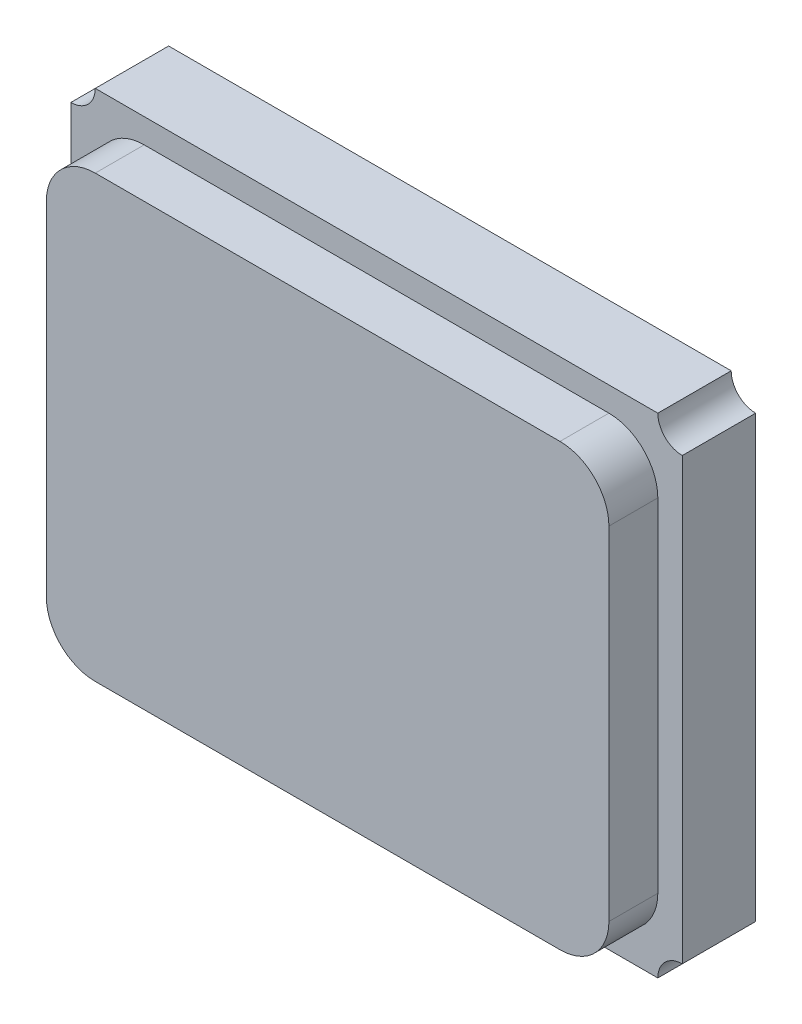
ISO-10303-21;
HEADER;
FILE_DESCRIPTION(('STEP AP214'),'2;1');
FILE_NAME('part.step','',(''),(''),'','','');
FILE_SCHEMA(('AUTOMOTIVE_DESIGN { 1 0 10303 214 1 1 1 1 }'));
ENDSEC;
DATA;
#1=APPLICATION_CONTEXT('core data for automotive mechanical design processes');
#2=APPLICATION_PROTOCOL_DEFINITION('international standard','automotive_design',2000,#1);
#3=PRODUCT_CONTEXT('',#1,'mechanical');
#4=PRODUCT('Part','Part','',(#3));
#5=PRODUCT_RELATED_PRODUCT_CATEGORY('part','',(#4));
#6=PRODUCT_DEFINITION_FORMATION('','',#4);
#7=PRODUCT_DEFINITION_CONTEXT('part definition',#1,'design');
#8=PRODUCT_DEFINITION('design','',#6,#7);
#9=PRODUCT_DEFINITION_SHAPE('','',#8);
#10=(LENGTH_UNIT() NAMED_UNIT(*) SI_UNIT(.MILLI.,.METRE.));
#11=(NAMED_UNIT(*) PLANE_ANGLE_UNIT() SI_UNIT($,.RADIAN.));
#12=(NAMED_UNIT(*) SI_UNIT($,.STERADIAN.) SOLID_ANGLE_UNIT());
#13=UNCERTAINTY_MEASURE_WITH_UNIT(LENGTH_MEASURE(1.E-05),#10,'distance_accuracy_value','');
#14=(GEOMETRIC_REPRESENTATION_CONTEXT(3) GLOBAL_UNCERTAINTY_ASSIGNED_CONTEXT((#13)) GLOBAL_UNIT_ASSIGNED_CONTEXT((#10,
#11,#12)) REPRESENTATION_CONTEXT('',''));
#15=CARTESIAN_POINT('',(0.,0.,0.));
#16=DIRECTION('',(0.,0.,1.));
#17=DIRECTION('',(1.,0.,0.));
#18=AXIS2_PLACEMENT_3D('',#15,#16,#17);
#19=CARTESIAN_POINT('',(-1.25,1.,0.3));
#20=DIRECTION('',(0.,0.,1.));
#21=DIRECTION('',(1.,0.,0.));
#22=AXIS2_PLACEMENT_3D('',#19,#20,#21);
#23=PLANE('',#22);
#24=CARTESIAN_POINT('',(-1.25,1.,0.3));
#25=DIRECTION('',(0.,0.,-1.));
#26=DIRECTION('',(1.,0.,0.));
#27=AXIS2_PLACEMENT_3D('',#24,#25,#26);
#28=CIRCLE('',#27,0.1);
#29=CARTESIAN_POINT('',(-1.15,0.999999999999999,0.3));
#30=VERTEX_POINT('',#29);
#31=CARTESIAN_POINT('',(-1.25,0.899999999999999,0.3));
#32=VERTEX_POINT('',#31);
#33=EDGE_CURVE('E156',#30,#32,#28,.T.);
#34=ORIENTED_EDGE('',*,*,#33,.T.);
#35=DIRECTION('',(0.,-1.,0.));
#36=VECTOR('',#35,1.);
#37=CARTESIAN_POINT('',(-1.25,-0.9,0.3));
#38=LINE('',#37,#36);
#39=CARTESIAN_POINT('',(-1.25,-0.9,0.3));
#40=VERTEX_POINT('',#39);
#41=EDGE_CURVE('E96',#32,#40,#38,.T.);
#42=ORIENTED_EDGE('',*,*,#41,.T.);
#43=CARTESIAN_POINT('',(-1.25,-1.,0.3));
#44=DIRECTION('',(0.,0.,-1.));
#45=DIRECTION('',(-1.,0.,0.));
#46=AXIS2_PLACEMENT_3D('',#43,#44,#45);
#47=CIRCLE('',#46,0.1);
#48=CARTESIAN_POINT('',(-1.15,-1.,0.3));
#49=VERTEX_POINT('',#48);
#50=EDGE_CURVE('E171',#40,#49,#47,.T.);
#51=ORIENTED_EDGE('',*,*,#50,.T.);
#52=DIRECTION('',(1.,0.,0.));
#53=VECTOR('',#52,1.);
#54=CARTESIAN_POINT('',(1.15,-1.,0.3));
#55=LINE('',#54,#53);
#56=CARTESIAN_POINT('',(1.15,-1.,0.3));
#57=VERTEX_POINT('',#56);
#58=EDGE_CURVE('E183',#49,#57,#55,.T.);
#59=ORIENTED_EDGE('',*,*,#58,.T.);
#60=CARTESIAN_POINT('',(1.25,-1.,0.3));
#61=DIRECTION('',(0.,0.,-1.));
#62=DIRECTION('',(1.,0.,0.));
#63=AXIS2_PLACEMENT_3D('',#60,#61,#62);
#64=CIRCLE('',#63,0.1);
#65=CARTESIAN_POINT('',(1.25,-0.9,0.3));
#66=VERTEX_POINT('',#65);
#67=EDGE_CURVE('E119',#57,#66,#64,.T.);
#68=ORIENTED_EDGE('',*,*,#67,.T.);
#69=DIRECTION('',(0.,1.,0.));
#70=VECTOR('',#69,1.);
#71=CARTESIAN_POINT('',(1.25,-0.9,0.3));
#72=LINE('',#71,#70);
#73=CARTESIAN_POINT('',(1.25,0.9,0.3));
#74=VERTEX_POINT('',#73);
#75=EDGE_CURVE('E112',#66,#74,#72,.T.);
#76=ORIENTED_EDGE('',*,*,#75,.T.);
#77=CARTESIAN_POINT('',(1.25,1.,0.3));
#78=DIRECTION('',(0.,0.,-1.));
#79=DIRECTION('',(-1.,0.,0.));
#80=AXIS2_PLACEMENT_3D('',#77,#78,#79);
#81=CIRCLE('',#80,0.1);
#82=CARTESIAN_POINT('',(1.15,1.,0.3));
#83=VERTEX_POINT('',#82);
#84=EDGE_CURVE('E116',#74,#83,#81,.T.);
#85=ORIENTED_EDGE('',*,*,#84,.T.);
#86=DIRECTION('',(-1.,0.,0.));
#87=VECTOR('',#86,1.);
#88=CARTESIAN_POINT('',(1.15,1.,0.3));
#89=LINE('',#88,#87);
#90=EDGE_CURVE('E55',#83,#30,#89,.T.);
#91=ORIENTED_EDGE('',*,*,#90,.T.);
#92=EDGE_LOOP('',(#34,#42,#51,#59,#68,#76,#85,#91));
#93=FACE_BOUND('',#92,.T.);
#94=DIRECTION('',(-1.,0.,0.));
#95=VECTOR('',#94,1.);
#96=CARTESIAN_POINT('',(-0.95,0.9,0.3));
#97=LINE('',#96,#95);
#98=CARTESIAN_POINT('',(0.95,0.9,0.3));
#99=VERTEX_POINT('',#98);
#100=CARTESIAN_POINT('',(-0.95,0.9,0.3));
#101=VERTEX_POINT('',#100);
#102=EDGE_CURVE('E228',#99,#101,#97,.T.);
#103=ORIENTED_EDGE('',*,*,#102,.F.);
#104=CARTESIAN_POINT('',(0.95,0.7,0.3));
#105=DIRECTION('',(0.,0.,1.));
#106=DIRECTION('',(-1.,0.,0.));
#107=AXIS2_PLACEMENT_3D('',#104,#105,#106);
#108=CIRCLE('',#107,0.2);
#109=CARTESIAN_POINT('',(1.15,0.7,0.3));
#110=VERTEX_POINT('',#109);
#111=EDGE_CURVE('E231',#110,#99,#108,.T.);
#112=ORIENTED_EDGE('',*,*,#111,.F.);
#113=DIRECTION('',(0.,1.,0.));
#114=VECTOR('',#113,1.);
#115=CARTESIAN_POINT('',(1.15,0.7,0.3));
#116=LINE('',#115,#114);
#117=CARTESIAN_POINT('',(1.15,-0.7,0.3));
#118=VERTEX_POINT('',#117);
#119=EDGE_CURVE('E211',#118,#110,#116,.T.);
#120=ORIENTED_EDGE('',*,*,#119,.F.);
#121=CARTESIAN_POINT('',(0.95,-0.7,0.3));
#122=DIRECTION('',(0.,0.,1.));
#123=DIRECTION('',(1.,0.,0.));
#124=AXIS2_PLACEMENT_3D('',#121,#122,#123);
#125=CIRCLE('',#124,0.2);
#126=CARTESIAN_POINT('',(0.95,-0.9,0.3));
#127=VERTEX_POINT('',#126);
#128=EDGE_CURVE('E214',#127,#118,#125,.T.);
#129=ORIENTED_EDGE('',*,*,#128,.F.);
#130=DIRECTION('',(1.,0.,0.));
#131=VECTOR('',#130,1.);
#132=CARTESIAN_POINT('',(-0.95,-0.9,0.3));
#133=LINE('',#132,#131);
#134=CARTESIAN_POINT('',(-0.95,-0.9,0.3));
#135=VERTEX_POINT('',#134);
#136=EDGE_CURVE('E216',#135,#127,#133,.T.);
#137=ORIENTED_EDGE('',*,*,#136,.F.);
#138=CARTESIAN_POINT('',(-0.95,-0.7,0.3));
#139=DIRECTION('',(0.,0.,1.));
#140=DIRECTION('',(-1.,0.,0.));
#141=AXIS2_PLACEMENT_3D('',#138,#139,#140);
#142=CIRCLE('',#141,0.2);
#143=CARTESIAN_POINT('',(-1.15,-0.7,0.3));
#144=VERTEX_POINT('',#143);
#145=EDGE_CURVE('E219',#144,#135,#142,.T.);
#146=ORIENTED_EDGE('',*,*,#145,.F.);
#147=DIRECTION('',(0.,-1.,0.));
#148=VECTOR('',#147,1.);
#149=CARTESIAN_POINT('',(-1.15,0.7,0.3));
#150=LINE('',#149,#148);
#151=CARTESIAN_POINT('',(-1.15,0.7,0.3));
#152=VERTEX_POINT('',#151);
#153=EDGE_CURVE('E222',#152,#144,#150,.T.);
#154=ORIENTED_EDGE('',*,*,#153,.F.);
#155=CARTESIAN_POINT('',(-0.95,0.7,0.3));
#156=DIRECTION('',(0.,0.,1.));
#157=DIRECTION('',(1.,0.,0.));
#158=AXIS2_PLACEMENT_3D('',#155,#156,#157);
#159=CIRCLE('',#158,0.2);
#160=EDGE_CURVE('E225',#101,#152,#159,.T.);
#161=ORIENTED_EDGE('',*,*,#160,.F.);
#162=EDGE_LOOP('',(#103,#112,#120,#129,#137,#146,#154,#161));
#163=FACE_BOUND('',#162,.T.);
#164=ADVANCED_FACE('F31',(#93,#163),#23,.T.);
#165=CARTESIAN_POINT('',(-1.25,1.,0.3));
#166=DIRECTION('',(0.,0.,-1.));
#167=DIRECTION('',(-1.,0.,0.));
#168=AXIS2_PLACEMENT_3D('',#165,#166,#167);
#169=CYLINDRICAL_SURFACE('',#168,0.1);
#170=CARTESIAN_POINT('',(-1.25,1.,0.));
#171=DIRECTION('',(0.,0.,-1.));
#172=DIRECTION('',(1.,0.,0.));
#173=AXIS2_PLACEMENT_3D('',#170,#171,#172);
#174=CIRCLE('',#173,0.1);
#175=CARTESIAN_POINT('',(-1.15,0.999999999999999,0.));
#176=VERTEX_POINT('',#175);
#177=CARTESIAN_POINT('',(-1.25,0.899999999999999,0.));
#178=VERTEX_POINT('',#177);
#179=EDGE_CURVE('E140',#176,#178,#174,.T.);
#180=ORIENTED_EDGE('',*,*,#179,.T.);
#181=DIRECTION('',(0.,0.,-1.));
#182=VECTOR('',#181,1.);
#183=CARTESIAN_POINT('',(-1.25,0.899999999999999,0.3));
#184=LINE('',#183,#182);
#185=EDGE_CURVE('E11',#32,#178,#184,.T.);
#186=ORIENTED_EDGE('',*,*,#185,.F.);
#187=ORIENTED_EDGE('',*,*,#33,.F.);
#188=DIRECTION('',(0.,0.,-1.));
#189=VECTOR('',#188,1.);
#190=CARTESIAN_POINT('',(-1.15,0.999999999999999,0.3));
#191=LINE('',#190,#189);
#192=EDGE_CURVE('E136',#30,#176,#191,.T.);
#193=ORIENTED_EDGE('',*,*,#192,.T.);
#194=EDGE_LOOP('',(#180,#186,#187,#193));
#195=FACE_BOUND('',#194,.T.);
#196=ADVANCED_FACE('F33',(#195),#169,.F.);
#197=CARTESIAN_POINT('',(-1.25,-0.9,0.3));
#198=DIRECTION('',(1.,0.,0.));
#199=DIRECTION('',(0.,1.,0.));
#200=AXIS2_PLACEMENT_3D('',#197,#198,#199);
#201=PLANE('',#200);
#202=DIRECTION('',(0.,-1.,0.));
#203=VECTOR('',#202,1.);
#204=CARTESIAN_POINT('',(-1.25,-0.9,0.));
#205=LINE('',#204,#203);
#206=CARTESIAN_POINT('',(-1.25,-0.9,0.));
#207=VERTEX_POINT('',#206);
#208=EDGE_CURVE('E143',#178,#207,#205,.T.);
#209=ORIENTED_EDGE('',*,*,#208,.T.);
#210=DIRECTION('',(0.,0.,-1.));
#211=VECTOR('',#210,1.);
#212=CARTESIAN_POINT('',(-1.25,-0.9,0.3));
#213=LINE('',#212,#211);
#214=EDGE_CURVE('E39',#40,#207,#213,.T.);
#215=ORIENTED_EDGE('',*,*,#214,.F.);
#216=ORIENTED_EDGE('',*,*,#41,.F.);
#217=ORIENTED_EDGE('',*,*,#185,.T.);
#218=EDGE_LOOP('',(#209,#215,#216,#217));
#219=FACE_BOUND('',#218,.T.);
#220=ADVANCED_FACE('F333',(#219),#201,.F.);
#221=CARTESIAN_POINT('',(-1.25,-1.,0.3));
#222=DIRECTION('',(0.,0.,-1.));
#223=DIRECTION('',(-1.,0.,0.));
#224=AXIS2_PLACEMENT_3D('',#221,#222,#223);
#225=CYLINDRICAL_SURFACE('',#224,0.1);
#226=CARTESIAN_POINT('',(-1.25,-1.,0.));
#227=DIRECTION('',(0.,0.,-1.));
#228=DIRECTION('',(-1.,0.,0.));
#229=AXIS2_PLACEMENT_3D('',#226,#227,#228);
#230=CIRCLE('',#229,0.1);
#231=CARTESIAN_POINT('',(-1.15,-1.,0.));
#232=VERTEX_POINT('',#231);
#233=EDGE_CURVE('E146',#207,#232,#230,.T.);
#234=ORIENTED_EDGE('',*,*,#233,.T.);
#235=DIRECTION('',(0.,0.,-1.));
#236=VECTOR('',#235,1.);
#237=CARTESIAN_POINT('',(-1.15,-1.,0.3));
#238=LINE('',#237,#236);
#239=EDGE_CURVE('E163',#49,#232,#238,.T.);
#240=ORIENTED_EDGE('',*,*,#239,.F.);
#241=ORIENTED_EDGE('',*,*,#50,.F.);
#242=ORIENTED_EDGE('',*,*,#214,.T.);
#243=EDGE_LOOP('',(#234,#240,#241,#242));
#244=FACE_BOUND('',#243,.T.);
#245=ADVANCED_FACE('F169',(#244),#225,.F.);
#246=CARTESIAN_POINT('',(1.15,-1.,0.3));
#247=DIRECTION('',(0.,1.,0.));
#248=DIRECTION('',(-1.,0.,0.));
#249=AXIS2_PLACEMENT_3D('',#246,#247,#248);
#250=PLANE('',#249);
#251=DIRECTION('',(1.,0.,0.));
#252=VECTOR('',#251,1.);
#253=CARTESIAN_POINT('',(1.15,-1.,0.));
#254=LINE('',#253,#252);
#255=CARTESIAN_POINT('',(1.15,-1.,0.));
#256=VERTEX_POINT('',#255);
#257=EDGE_CURVE('E148',#232,#256,#254,.T.);
#258=ORIENTED_EDGE('',*,*,#257,.T.);
#259=DIRECTION('',(0.,0.,-1.));
#260=VECTOR('',#259,1.);
#261=CARTESIAN_POINT('',(1.15,-1.,0.3));
#262=LINE('',#261,#260);
#263=EDGE_CURVE('E160',#57,#256,#262,.T.);
#264=ORIENTED_EDGE('',*,*,#263,.F.);
#265=ORIENTED_EDGE('',*,*,#58,.F.);
#266=ORIENTED_EDGE('',*,*,#239,.T.);
#267=EDGE_LOOP('',(#258,#264,#265,#266));
#268=FACE_BOUND('',#267,.T.);
#269=ADVANCED_FACE('F179',(#268),#250,.F.);
#270=CARTESIAN_POINT('',(1.25,-1.,0.3));
#271=DIRECTION('',(0.,0.,-1.));
#272=DIRECTION('',(-1.,0.,0.));
#273=AXIS2_PLACEMENT_3D('',#270,#271,#272);
#274=CYLINDRICAL_SURFACE('',#273,0.1);
#275=CARTESIAN_POINT('',(1.25,-1.,0.));
#276=DIRECTION('',(0.,0.,-1.));
#277=DIRECTION('',(1.,0.,0.));
#278=AXIS2_PLACEMENT_3D('',#275,#276,#277);
#279=CIRCLE('',#278,0.1);
#280=CARTESIAN_POINT('',(1.25,-0.9,0.));
#281=VERTEX_POINT('',#280);
#282=EDGE_CURVE('E150',#256,#281,#279,.T.);
#283=ORIENTED_EDGE('',*,*,#282,.T.);
#284=DIRECTION('',(0.,0.,-1.));
#285=VECTOR('',#284,1.);
#286=CARTESIAN_POINT('',(1.25,-0.9,0.3));
#287=LINE('',#286,#285);
#288=EDGE_CURVE('E131',#66,#281,#287,.T.);
#289=ORIENTED_EDGE('',*,*,#288,.F.);
#290=ORIENTED_EDGE('',*,*,#67,.F.);
#291=ORIENTED_EDGE('',*,*,#263,.T.);
#292=EDGE_LOOP('',(#283,#289,#290,#291));
#293=FACE_BOUND('',#292,.T.);
#294=ADVANCED_FACE('F182',(#293),#274,.F.);
#295=CARTESIAN_POINT('',(1.25,-0.9,0.3));
#296=DIRECTION('',(-1.,0.,0.));
#297=DIRECTION('',(0.,-1.,0.));
#298=AXIS2_PLACEMENT_3D('',#295,#296,#297);
#299=PLANE('',#298);
#300=DIRECTION('',(0.,1.,0.));
#301=VECTOR('',#300,1.);
#302=CARTESIAN_POINT('',(1.25,-0.9,0.));
#303=LINE('',#302,#301);
#304=CARTESIAN_POINT('',(1.25,0.9,0.));
#305=VERTEX_POINT('',#304);
#306=EDGE_CURVE('E128',#281,#305,#303,.T.);
#307=ORIENTED_EDGE('',*,*,#306,.T.);
#308=DIRECTION('',(0.,0.,-1.));
#309=VECTOR('',#308,1.);
#310=CARTESIAN_POINT('',(1.25,0.9,0.3));
#311=LINE('',#310,#309);
#312=EDGE_CURVE('E125',#74,#305,#311,.T.);
#313=ORIENTED_EDGE('',*,*,#312,.F.);
#314=ORIENTED_EDGE('',*,*,#75,.F.);
#315=ORIENTED_EDGE('',*,*,#288,.T.);
#316=EDGE_LOOP('',(#307,#313,#314,#315));
#317=FACE_BOUND('',#316,.T.);
#318=ADVANCED_FACE('F126',(#317),#299,.F.);
#319=CARTESIAN_POINT('',(1.25,1.,0.3));
#320=DIRECTION('',(0.,0.,-1.));
#321=DIRECTION('',(-1.,0.,0.));
#322=AXIS2_PLACEMENT_3D('',#319,#320,#321);
#323=CYLINDRICAL_SURFACE('',#322,0.1);
#324=CARTESIAN_POINT('',(1.25,1.,0.));
#325=DIRECTION('',(0.,0.,-1.));
#326=DIRECTION('',(-1.,0.,0.));
#327=AXIS2_PLACEMENT_3D('',#324,#325,#326);
#328=CIRCLE('',#327,0.1);
#329=CARTESIAN_POINT('',(1.15,1.,0.));
#330=VERTEX_POINT('',#329);
#331=EDGE_CURVE('E153',#305,#330,#328,.T.);
#332=ORIENTED_EDGE('',*,*,#331,.T.);
#333=DIRECTION('',(0.,0.,-1.));
#334=VECTOR('',#333,1.);
#335=CARTESIAN_POINT('',(1.15,1.,0.3));
#336=LINE('',#335,#334);
#337=EDGE_CURVE('E132',#83,#330,#336,.T.);
#338=ORIENTED_EDGE('',*,*,#337,.F.);
#339=ORIENTED_EDGE('',*,*,#84,.F.);
#340=ORIENTED_EDGE('',*,*,#312,.T.);
#341=EDGE_LOOP('',(#332,#338,#339,#340));
#342=FACE_BOUND('',#341,.T.);
#343=ADVANCED_FACE('F134',(#342),#323,.F.);
#344=CARTESIAN_POINT('',(1.15,1.,0.3));
#345=DIRECTION('',(0.,-1.,0.));
#346=DIRECTION('',(1.,0.,0.));
#347=AXIS2_PLACEMENT_3D('',#344,#345,#346);
#348=PLANE('',#347);
#349=DIRECTION('',(-1.,0.,0.));
#350=VECTOR('',#349,1.);
#351=CARTESIAN_POINT('',(1.15,1.,0.));
#352=LINE('',#351,#350);
#353=EDGE_CURVE('E88',#330,#176,#352,.T.);
#354=ORIENTED_EDGE('',*,*,#353,.T.);
#355=ORIENTED_EDGE('',*,*,#192,.F.);
#356=ORIENTED_EDGE('',*,*,#90,.F.);
#357=ORIENTED_EDGE('',*,*,#337,.T.);
#358=EDGE_LOOP('',(#354,#355,#356,#357));
#359=FACE_BOUND('',#358,.T.);
#360=ADVANCED_FACE('F340',(#359),#348,.F.);
#361=CARTESIAN_POINT('',(-1.25,1.,0.));
#362=DIRECTION('',(0.,0.,1.));
#363=DIRECTION('',(1.,0.,0.));
#364=AXIS2_PLACEMENT_3D('',#361,#362,#363);
#365=PLANE('',#364);
#366=ORIENTED_EDGE('',*,*,#179,.F.);
#367=ORIENTED_EDGE('',*,*,#353,.F.);
#368=ORIENTED_EDGE('',*,*,#331,.F.);
#369=ORIENTED_EDGE('',*,*,#306,.F.);
#370=ORIENTED_EDGE('',*,*,#282,.F.);
#371=ORIENTED_EDGE('',*,*,#257,.F.);
#372=ORIENTED_EDGE('',*,*,#233,.F.);
#373=ORIENTED_EDGE('',*,*,#208,.F.);
#374=EDGE_LOOP('',(#366,#367,#368,#369,#370,#371,#372,#373));
#375=FACE_BOUND('',#374,.T.);
#376=ADVANCED_FACE('F175',(#375),#365,.F.);
#377=CARTESIAN_POINT('',(0.95,0.7,0.5));
#378=DIRECTION('',(0.,0.,-1.));
#379=DIRECTION('',(-1.,0.,0.));
#380=AXIS2_PLACEMENT_3D('',#377,#378,#379);
#381=CYLINDRICAL_SURFACE('',#380,0.2);
#382=ORIENTED_EDGE('',*,*,#111,.T.);
#383=DIRECTION('',(0.,0.,-1.));
#384=VECTOR('',#383,1.);
#385=CARTESIAN_POINT('',(0.95,0.9,0.5));
#386=LINE('',#385,#384);
#387=CARTESIAN_POINT('',(0.95,0.9,0.5));
#388=VERTEX_POINT('',#387);
#389=EDGE_CURVE('E144',#388,#99,#386,.T.);
#390=ORIENTED_EDGE('',*,*,#389,.F.);
#391=CARTESIAN_POINT('',(0.95,0.7,0.5));
#392=DIRECTION('',(0.,0.,1.));
#393=DIRECTION('',(-1.,0.,0.));
#394=AXIS2_PLACEMENT_3D('',#391,#392,#393);
#395=CIRCLE('',#394,0.2);
#396=CARTESIAN_POINT('',(1.15,0.7,0.5));
#397=VERTEX_POINT('',#396);
#398=EDGE_CURVE('E213',#397,#388,#395,.T.);
#399=ORIENTED_EDGE('',*,*,#398,.F.);
#400=DIRECTION('',(0.,0.,-1.));
#401=VECTOR('',#400,1.);
#402=CARTESIAN_POINT('',(1.15,0.7,0.5));
#403=LINE('',#402,#401);
#404=EDGE_CURVE('E207',#397,#110,#403,.T.);
#405=ORIENTED_EDGE('',*,*,#404,.T.);
#406=EDGE_LOOP('',(#382,#390,#399,#405));
#407=FACE_BOUND('',#406,.T.);
#408=ADVANCED_FACE('F266',(#407),#381,.T.);
#409=CARTESIAN_POINT('',(-0.95,0.9,0.5));
#410=DIRECTION('',(0.,-1.,0.));
#411=DIRECTION('',(1.,0.,0.));
#412=AXIS2_PLACEMENT_3D('',#409,#410,#411);
#413=PLANE('',#412);
#414=ORIENTED_EDGE('',*,*,#102,.T.);
#415=DIRECTION('',(0.,0.,-1.));
#416=VECTOR('',#415,1.);
#417=CARTESIAN_POINT('',(-0.95,0.9,0.5));
#418=LINE('',#417,#416);
#419=CARTESIAN_POINT('',(-0.95,0.9,0.5));
#420=VERTEX_POINT('',#419);
#421=EDGE_CURVE('E191',#420,#101,#418,.T.);
#422=ORIENTED_EDGE('',*,*,#421,.F.);
#423=DIRECTION('',(-1.,0.,0.));
#424=VECTOR('',#423,1.);
#425=CARTESIAN_POINT('',(-0.95,0.9,0.5));
#426=LINE('',#425,#424);
#427=EDGE_CURVE('E251',#388,#420,#426,.T.);
#428=ORIENTED_EDGE('',*,*,#427,.F.);
#429=ORIENTED_EDGE('',*,*,#389,.T.);
#430=EDGE_LOOP('',(#414,#422,#428,#429));
#431=FACE_BOUND('',#430,.T.);
#432=ADVANCED_FACE('F271',(#431),#413,.F.);
#433=CARTESIAN_POINT('',(-0.95,0.7,0.5));
#434=DIRECTION('',(0.,0.,-1.));
#435=DIRECTION('',(-1.,0.,0.));
#436=AXIS2_PLACEMENT_3D('',#433,#434,#435);
#437=CYLINDRICAL_SURFACE('',#436,0.2);
#438=ORIENTED_EDGE('',*,*,#160,.T.);
#439=DIRECTION('',(0.,0.,-1.));
#440=VECTOR('',#439,1.);
#441=CARTESIAN_POINT('',(-1.15,0.7,0.5));
#442=LINE('',#441,#440);
#443=CARTESIAN_POINT('',(-1.15,0.7,0.5));
#444=VERTEX_POINT('',#443);
#445=EDGE_CURVE('E194',#444,#152,#442,.T.);
#446=ORIENTED_EDGE('',*,*,#445,.F.);
#447=CARTESIAN_POINT('',(-0.95,0.7,0.5));
#448=DIRECTION('',(0.,0.,1.));
#449=DIRECTION('',(1.,0.,0.));
#450=AXIS2_PLACEMENT_3D('',#447,#448,#449);
#451=CIRCLE('',#450,0.2);
#452=EDGE_CURVE('E248',#420,#444,#451,.T.);
#453=ORIENTED_EDGE('',*,*,#452,.F.);
#454=ORIENTED_EDGE('',*,*,#421,.T.);
#455=EDGE_LOOP('',(#438,#446,#453,#454));
#456=FACE_BOUND('',#455,.T.);
#457=ADVANCED_FACE('F295',(#456),#437,.T.);
#458=CARTESIAN_POINT('',(-1.15,0.7,0.5));
#459=DIRECTION('',(1.,0.,0.));
#460=DIRECTION('',(0.,0.,-1.));
#461=AXIS2_PLACEMENT_3D('',#458,#459,#460);
#462=PLANE('',#461);
#463=ORIENTED_EDGE('',*,*,#153,.T.);
#464=DIRECTION('',(0.,0.,-1.));
#465=VECTOR('',#464,1.);
#466=CARTESIAN_POINT('',(-1.15,-0.7,0.5));
#467=LINE('',#466,#465);
#468=CARTESIAN_POINT('',(-1.15,-0.7,0.5));
#469=VERTEX_POINT('',#468);
#470=EDGE_CURVE('E197',#469,#144,#467,.T.);
#471=ORIENTED_EDGE('',*,*,#470,.F.);
#472=DIRECTION('',(0.,-1.,0.));
#473=VECTOR('',#472,1.);
#474=CARTESIAN_POINT('',(-1.15,0.7,0.5));
#475=LINE('',#474,#473);
#476=EDGE_CURVE('E245',#444,#469,#475,.T.);
#477=ORIENTED_EDGE('',*,*,#476,.F.);
#478=ORIENTED_EDGE('',*,*,#445,.T.);
#479=EDGE_LOOP('',(#463,#471,#477,#478));
#480=FACE_BOUND('',#479,.T.);
#481=ADVANCED_FACE('F300',(#480),#462,.F.);
#482=CARTESIAN_POINT('',(-0.95,-0.7,0.5));
#483=DIRECTION('',(0.,0.,-1.));
#484=DIRECTION('',(-1.,0.,0.));
#485=AXIS2_PLACEMENT_3D('',#482,#483,#484);
#486=CYLINDRICAL_SURFACE('',#485,0.2);
#487=ORIENTED_EDGE('',*,*,#145,.T.);
#488=DIRECTION('',(0.,0.,-1.));
#489=VECTOR('',#488,1.);
#490=CARTESIAN_POINT('',(-0.95,-0.9,0.5));
#491=LINE('',#490,#489);
#492=CARTESIAN_POINT('',(-0.95,-0.9,0.5));
#493=VERTEX_POINT('',#492);
#494=EDGE_CURVE('E200',#493,#135,#491,.T.);
#495=ORIENTED_EDGE('',*,*,#494,.F.);
#496=CARTESIAN_POINT('',(-0.95,-0.7,0.5));
#497=DIRECTION('',(0.,0.,1.));
#498=DIRECTION('',(-1.,0.,0.));
#499=AXIS2_PLACEMENT_3D('',#496,#497,#498);
#500=CIRCLE('',#499,0.2);
#501=EDGE_CURVE('E242',#469,#493,#500,.T.);
#502=ORIENTED_EDGE('',*,*,#501,.F.);
#503=ORIENTED_EDGE('',*,*,#470,.T.);
#504=EDGE_LOOP('',(#487,#495,#502,#503));
#505=FACE_BOUND('',#504,.T.);
#506=ADVANCED_FACE('F318',(#505),#486,.T.);
#507=CARTESIAN_POINT('',(-0.95,-0.9,0.5));
#508=DIRECTION('',(0.,1.,0.));
#509=DIRECTION('',(-1.,0.,0.));
#510=AXIS2_PLACEMENT_3D('',#507,#508,#509);
#511=PLANE('',#510);
#512=ORIENTED_EDGE('',*,*,#136,.T.);
#513=DIRECTION('',(0.,0.,-1.));
#514=VECTOR('',#513,1.);
#515=CARTESIAN_POINT('',(0.95,-0.9,0.5));
#516=LINE('',#515,#514);
#517=CARTESIAN_POINT('',(0.95,-0.9,0.5));
#518=VERTEX_POINT('',#517);
#519=EDGE_CURVE('E203',#518,#127,#516,.T.);
#520=ORIENTED_EDGE('',*,*,#519,.F.);
#521=DIRECTION('',(1.,0.,0.));
#522=VECTOR('',#521,1.);
#523=CARTESIAN_POINT('',(-0.95,-0.9,0.5));
#524=LINE('',#523,#522);
#525=EDGE_CURVE('E239',#493,#518,#524,.T.);
#526=ORIENTED_EDGE('',*,*,#525,.F.);
#527=ORIENTED_EDGE('',*,*,#494,.T.);
#528=EDGE_LOOP('',(#512,#520,#526,#527));
#529=FACE_BOUND('',#528,.T.);
#530=ADVANCED_FACE('F319',(#529),#511,.F.);
#531=CARTESIAN_POINT('',(0.95,-0.7,0.5));
#532=DIRECTION('',(0.,0.,-1.));
#533=DIRECTION('',(-1.,0.,0.));
#534=AXIS2_PLACEMENT_3D('',#531,#532,#533);
#535=CYLINDRICAL_SURFACE('',#534,0.2);
#536=ORIENTED_EDGE('',*,*,#128,.T.);
#537=DIRECTION('',(0.,0.,-1.));
#538=VECTOR('',#537,1.);
#539=CARTESIAN_POINT('',(1.15,-0.7,0.5));
#540=LINE('',#539,#538);
#541=CARTESIAN_POINT('',(1.15,-0.7,0.5));
#542=VERTEX_POINT('',#541);
#543=EDGE_CURVE('E46',#542,#118,#540,.T.);
#544=ORIENTED_EDGE('',*,*,#543,.F.);
#545=CARTESIAN_POINT('',(0.95,-0.7,0.5));
#546=DIRECTION('',(0.,0.,1.));
#547=DIRECTION('',(1.,0.,0.));
#548=AXIS2_PLACEMENT_3D('',#545,#546,#547);
#549=CIRCLE('',#548,0.2);
#550=EDGE_CURVE('E236',#518,#542,#549,.T.);
#551=ORIENTED_EDGE('',*,*,#550,.F.);
#552=ORIENTED_EDGE('',*,*,#519,.T.);
#553=EDGE_LOOP('',(#536,#544,#551,#552));
#554=FACE_BOUND('',#553,.T.);
#555=ADVANCED_FACE('F316',(#554),#535,.T.);
#556=CARTESIAN_POINT('',(1.15,0.7,0.5));
#557=DIRECTION('',(-1.,0.,0.));
#558=DIRECTION('',(0.,0.,1.));
#559=AXIS2_PLACEMENT_3D('',#556,#557,#558);
#560=PLANE('',#559);
#561=ORIENTED_EDGE('',*,*,#119,.T.);
#562=ORIENTED_EDGE('',*,*,#404,.F.);
#563=DIRECTION('',(0.,1.,0.));
#564=VECTOR('',#563,1.);
#565=CARTESIAN_POINT('',(1.15,0.7,0.5));
#566=LINE('',#565,#564);
#567=EDGE_CURVE('E210',#542,#397,#566,.T.);
#568=ORIENTED_EDGE('',*,*,#567,.F.);
#569=ORIENTED_EDGE('',*,*,#543,.T.);
#570=EDGE_LOOP('',(#561,#562,#568,#569));
#571=FACE_BOUND('',#570,.T.);
#572=ADVANCED_FACE('F288',(#571),#560,.F.);
#573=CARTESIAN_POINT('',(0.95,0.7,0.5));
#574=DIRECTION('',(0.,0.,-1.));
#575=DIRECTION('',(-1.,0.,0.));
#576=AXIS2_PLACEMENT_3D('',#573,#574,#575);
#577=PLANE('',#576);
#578=ORIENTED_EDGE('',*,*,#398,.T.);
#579=ORIENTED_EDGE('',*,*,#427,.T.);
#580=ORIENTED_EDGE('',*,*,#452,.T.);
#581=ORIENTED_EDGE('',*,*,#476,.T.);
#582=ORIENTED_EDGE('',*,*,#501,.T.);
#583=ORIENTED_EDGE('',*,*,#525,.T.);
#584=ORIENTED_EDGE('',*,*,#550,.T.);
#585=ORIENTED_EDGE('',*,*,#567,.T.);
#586=EDGE_LOOP('',(#578,#579,#580,#581,#582,#583,#584,#585));
#587=FACE_BOUND('',#586,.T.);
#588=ADVANCED_FACE('F259',(#587),#577,.F.);
#589=CLOSED_SHELL('',(#164,#196,#220,#245,#269,#294,#318,#343,#360,#376,#408,#432,#457,#481,
#506,#530,#555,#572,#588));
#590=MANIFOLD_SOLID_BREP('B2',#589);
#591=ADVANCED_BREP_SHAPE_REPRESENTATION('',(#18,#590),#14);
#592=SHAPE_DEFINITION_REPRESENTATION(#9,#591);
ENDSEC;
END-ISO-10303-21;
